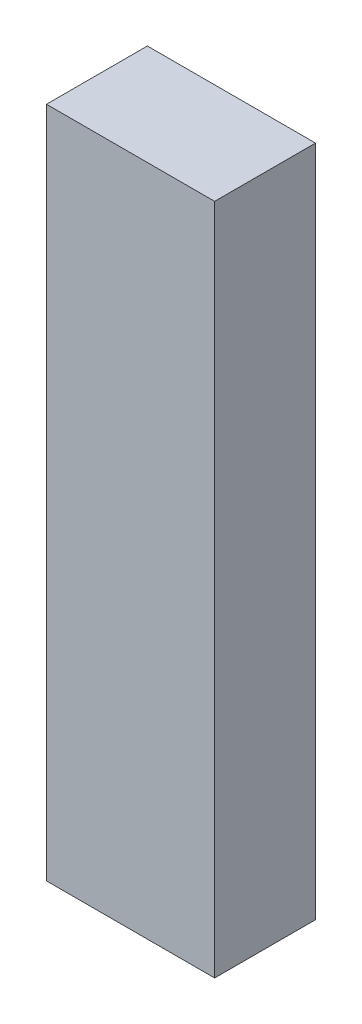
ISO-10303-21;
HEADER;
FILE_DESCRIPTION(('STEP AP214'),'2;1');
FILE_NAME('part.step','',(''),(''),'','','');
FILE_SCHEMA(('AUTOMOTIVE_DESIGN { 1 0 10303 214 1 1 1 1 }'));
ENDSEC;
DATA;
#1=APPLICATION_CONTEXT('core data for automotive mechanical design processes');
#2=APPLICATION_PROTOCOL_DEFINITION('international standard','automotive_design',2000,#1);
#3=PRODUCT_CONTEXT('',#1,'mechanical');
#4=PRODUCT('Part','Part','',(#3));
#5=PRODUCT_RELATED_PRODUCT_CATEGORY('part','',(#4));
#6=PRODUCT_DEFINITION_FORMATION('','',#4);
#7=PRODUCT_DEFINITION_CONTEXT('part definition',#1,'design');
#8=PRODUCT_DEFINITION('design','',#6,#7);
#9=PRODUCT_DEFINITION_SHAPE('','',#8);
#10=(LENGTH_UNIT() NAMED_UNIT(*) SI_UNIT(.MILLI.,.METRE.));
#11=(NAMED_UNIT(*) PLANE_ANGLE_UNIT() SI_UNIT($,.RADIAN.));
#12=(NAMED_UNIT(*) SI_UNIT($,.STERADIAN.) SOLID_ANGLE_UNIT());
#13=UNCERTAINTY_MEASURE_WITH_UNIT(LENGTH_MEASURE(1.E-05),#10,'distance_accuracy_value','');
#14=(GEOMETRIC_REPRESENTATION_CONTEXT(3) GLOBAL_UNCERTAINTY_ASSIGNED_CONTEXT((#13)) GLOBAL_UNIT_ASSIGNED_CONTEXT((#10,
#11,#12)) REPRESENTATION_CONTEXT('',''));
#15=CARTESIAN_POINT('',(0.,0.,0.));
#16=DIRECTION('',(0.,0.,1.));
#17=DIRECTION('',(1.,0.,0.));
#18=AXIS2_PLACEMENT_3D('',#15,#16,#17);
#19=CARTESIAN_POINT('',(12.5,100.,7.5));
#20=DIRECTION('',(-1.,0.,0.));
#21=DIRECTION('',(0.,0.,1.));
#22=AXIS2_PLACEMENT_3D('',#19,#20,#21);
#23=PLANE('',#22);
#24=DIRECTION('',(0.,0.,-1.));
#25=VECTOR('',#24,1.);
#26=CARTESIAN_POINT('',(12.5,0.,7.5));
#27=LINE('',#26,#25);
#28=CARTESIAN_POINT('',(12.5,0.,7.5));
#29=VERTEX_POINT('',#28);
#30=CARTESIAN_POINT('',(12.5,0.,-7.5));
#31=VERTEX_POINT('',#30);
#32=EDGE_CURVE('E107',#29,#31,#27,.T.);
#33=ORIENTED_EDGE('',*,*,#32,.T.);
#34=DIRECTION('',(0.,-1.,0.));
#35=VECTOR('',#34,1.);
#36=CARTESIAN_POINT('',(12.5,100.,-7.5));
#37=LINE('',#36,#35);
#38=CARTESIAN_POINT('',(12.5,100.,-7.5));
#39=VERTEX_POINT('',#38);
#40=EDGE_CURVE('E11',#39,#31,#37,.T.);
#41=ORIENTED_EDGE('',*,*,#40,.F.);
#42=DIRECTION('',(0.,0.,-1.));
#43=VECTOR('',#42,1.);
#44=CARTESIAN_POINT('',(12.5,100.,7.5));
#45=LINE('',#44,#43);
#46=CARTESIAN_POINT('',(12.5,100.,7.5));
#47=VERTEX_POINT('',#46);
#48=EDGE_CURVE('E91',#47,#39,#45,.T.);
#49=ORIENTED_EDGE('',*,*,#48,.F.);
#50=DIRECTION('',(0.,-1.,0.));
#51=VECTOR('',#50,1.);
#52=CARTESIAN_POINT('',(12.5,100.,7.5));
#53=LINE('',#52,#51);
#54=EDGE_CURVE('E103',#47,#29,#53,.T.);
#55=ORIENTED_EDGE('',*,*,#54,.T.);
#56=EDGE_LOOP('',(#33,#41,#49,#55));
#57=FACE_BOUND('',#56,.T.);
#58=ADVANCED_FACE('F39',(#57),#23,.F.);
#59=CARTESIAN_POINT('',(-12.5,100.,-7.5));
#60=DIRECTION('',(0.,0.,1.));
#61=DIRECTION('',(1.,0.,0.));
#62=AXIS2_PLACEMENT_3D('',#59,#60,#61);
#63=PLANE('',#62);
#64=DIRECTION('',(-1.,0.,0.));
#65=VECTOR('',#64,1.);
#66=CARTESIAN_POINT('',(-12.5,0.,-7.5));
#67=LINE('',#66,#65);
#68=CARTESIAN_POINT('',(-12.5,0.,-7.5));
#69=VERTEX_POINT('',#68);
#70=EDGE_CURVE('E96',#31,#69,#67,.T.);
#71=ORIENTED_EDGE('',*,*,#70,.T.);
#72=DIRECTION('',(0.,-1.,0.));
#73=VECTOR('',#72,1.);
#74=CARTESIAN_POINT('',(-12.5,100.,-7.5));
#75=LINE('',#74,#73);
#76=CARTESIAN_POINT('',(-12.5,100.,-7.5));
#77=VERTEX_POINT('',#76);
#78=EDGE_CURVE('E48',#77,#69,#75,.T.);
#79=ORIENTED_EDGE('',*,*,#78,.F.);
#80=DIRECTION('',(-1.,0.,0.));
#81=VECTOR('',#80,1.);
#82=CARTESIAN_POINT('',(-12.5,100.,-7.5));
#83=LINE('',#82,#81);
#84=EDGE_CURVE('E86',#39,#77,#83,.T.);
#85=ORIENTED_EDGE('',*,*,#84,.F.);
#86=ORIENTED_EDGE('',*,*,#40,.T.);
#87=EDGE_LOOP('',(#71,#79,#85,#86));
#88=FACE_BOUND('',#87,.T.);
#89=ADVANCED_FACE('F95',(#88),#63,.F.);
#90=CARTESIAN_POINT('',(-12.5,100.,7.5));
#91=DIRECTION('',(1.,0.,0.));
#92=DIRECTION('',(0.,0.,-1.));
#93=AXIS2_PLACEMENT_3D('',#90,#91,#92);
#94=PLANE('',#93);
#95=DIRECTION('',(0.,0.,1.));
#96=VECTOR('',#95,1.);
#97=CARTESIAN_POINT('',(-12.5,0.,7.5));
#98=LINE('',#97,#96);
#99=CARTESIAN_POINT('',(-12.5,0.,7.5));
#100=VERTEX_POINT('',#99);
#101=EDGE_CURVE('E73',#69,#100,#98,.T.);
#102=ORIENTED_EDGE('',*,*,#101,.T.);
#103=DIRECTION('',(0.,-1.,0.));
#104=VECTOR('',#103,1.);
#105=CARTESIAN_POINT('',(-12.5,100.,7.5));
#106=LINE('',#105,#104);
#107=CARTESIAN_POINT('',(-12.5,100.,7.5));
#108=VERTEX_POINT('',#107);
#109=EDGE_CURVE('E98',#108,#100,#106,.T.);
#110=ORIENTED_EDGE('',*,*,#109,.F.);
#111=DIRECTION('',(0.,0.,1.));
#112=VECTOR('',#111,1.);
#113=CARTESIAN_POINT('',(-12.5,100.,7.5));
#114=LINE('',#113,#112);
#115=EDGE_CURVE('E89',#77,#108,#114,.T.);
#116=ORIENTED_EDGE('',*,*,#115,.F.);
#117=ORIENTED_EDGE('',*,*,#78,.T.);
#118=EDGE_LOOP('',(#102,#110,#116,#117));
#119=FACE_BOUND('',#118,.T.);
#120=ADVANCED_FACE('F99',(#119),#94,.F.);
#121=CARTESIAN_POINT('',(-12.5,100.,7.5));
#122=DIRECTION('',(0.,0.,-1.));
#123=DIRECTION('',(-1.,0.,0.));
#124=AXIS2_PLACEMENT_3D('',#121,#122,#123);
#125=PLANE('',#124);
#126=DIRECTION('',(1.,0.,0.));
#127=VECTOR('',#126,1.);
#128=CARTESIAN_POINT('',(-12.5,0.,7.5));
#129=LINE('',#128,#127);
#130=EDGE_CURVE('E79',#100,#29,#129,.T.);
#131=ORIENTED_EDGE('',*,*,#130,.T.);
#132=ORIENTED_EDGE('',*,*,#54,.F.);
#133=DIRECTION('',(1.,0.,0.));
#134=VECTOR('',#133,1.);
#135=CARTESIAN_POINT('',(-12.5,100.,7.5));
#136=LINE('',#135,#134);
#137=EDGE_CURVE('E56',#108,#47,#136,.T.);
#138=ORIENTED_EDGE('',*,*,#137,.F.);
#139=ORIENTED_EDGE('',*,*,#109,.T.);
#140=EDGE_LOOP('',(#131,#132,#138,#139));
#141=FACE_BOUND('',#140,.T.);
#142=ADVANCED_FACE('F120',(#141),#125,.F.);
#143=CARTESIAN_POINT('',(0.,100.,0.));
#144=DIRECTION('',(0.,-1.,0.));
#145=DIRECTION('',(0.,0.,-1.));
#146=AXIS2_PLACEMENT_3D('',#143,#144,#145);
#147=PLANE('',#146);
#148=ORIENTED_EDGE('',*,*,#48,.T.);
#149=ORIENTED_EDGE('',*,*,#84,.T.);
#150=ORIENTED_EDGE('',*,*,#115,.T.);
#151=ORIENTED_EDGE('',*,*,#137,.T.);
#152=EDGE_LOOP('',(#148,#149,#150,#151));
#153=FACE_BOUND('',#152,.T.);
#154=ADVANCED_FACE('F87',(#153),#147,.F.);
#155=CARTESIAN_POINT('',(0.,0.,0.));
#156=DIRECTION('',(0.,-1.,0.));
#157=DIRECTION('',(0.,0.,-1.));
#158=AXIS2_PLACEMENT_3D('',#155,#156,#157);
#159=PLANE('',#158);
#160=ORIENTED_EDGE('',*,*,#32,.F.);
#161=ORIENTED_EDGE('',*,*,#130,.F.);
#162=ORIENTED_EDGE('',*,*,#101,.F.);
#163=ORIENTED_EDGE('',*,*,#70,.F.);
#164=EDGE_LOOP('',(#160,#161,#162,#163));
#165=FACE_BOUND('',#164,.T.);
#166=ADVANCED_FACE('F123',(#165),#159,.T.);
#167=CLOSED_SHELL('',(#58,#89,#120,#142,#154,#166));
#168=MANIFOLD_SOLID_BREP('B2',#167);
#169=ADVANCED_BREP_SHAPE_REPRESENTATION('',(#18,#168),#14);
#170=SHAPE_DEFINITION_REPRESENTATION(#9,#169);
ENDSEC;
END-ISO-10303-21;
